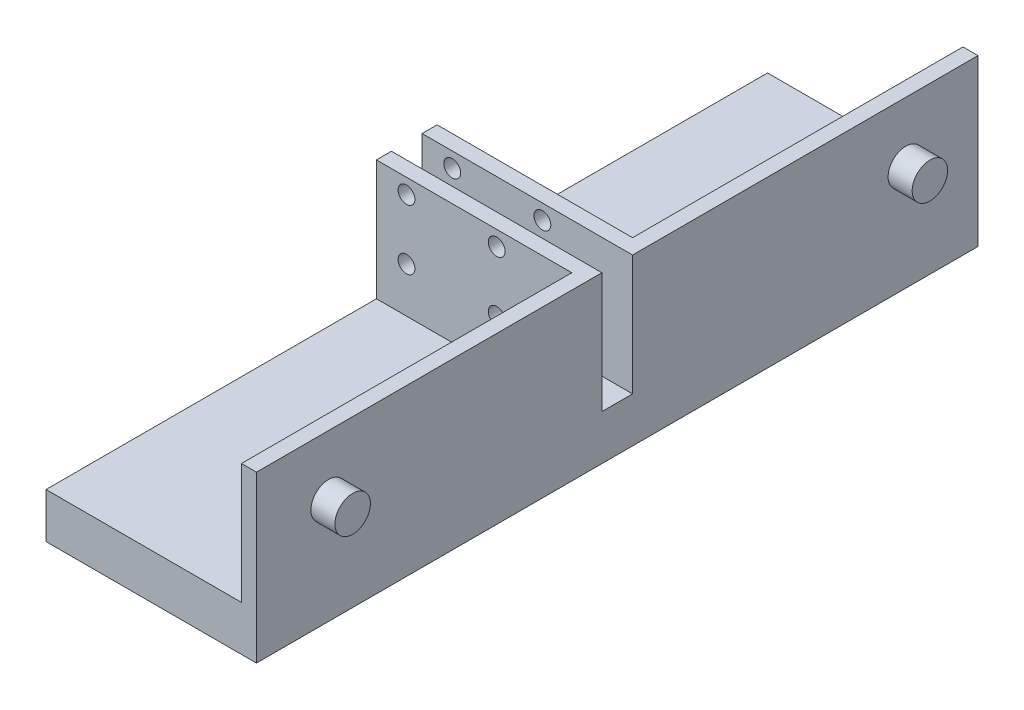
ISO-10303-21;
HEADER;
FILE_DESCRIPTION(('STEP AP214'),'2;1');
FILE_NAME('part.step','',(''),(''),'','','');
FILE_SCHEMA(('AUTOMOTIVE_DESIGN { 1 0 10303 214 1 1 1 1 }'));
ENDSEC;
DATA;
#1=APPLICATION_CONTEXT('core data for automotive mechanical design processes');
#2=APPLICATION_PROTOCOL_DEFINITION('international standard','automotive_design',2000,#1);
#3=PRODUCT_CONTEXT('',#1,'mechanical');
#4=PRODUCT('Part','Part','',(#3));
#5=PRODUCT_RELATED_PRODUCT_CATEGORY('part','',(#4));
#6=PRODUCT_DEFINITION_FORMATION('','',#4);
#7=PRODUCT_DEFINITION_CONTEXT('part definition',#1,'design');
#8=PRODUCT_DEFINITION('design','',#6,#7);
#9=PRODUCT_DEFINITION_SHAPE('','',#8);
#10=(LENGTH_UNIT() NAMED_UNIT(*) SI_UNIT(.MILLI.,.METRE.));
#11=(NAMED_UNIT(*) PLANE_ANGLE_UNIT() SI_UNIT($,.RADIAN.));
#12=(NAMED_UNIT(*) SI_UNIT($,.STERADIAN.) SOLID_ANGLE_UNIT());
#13=UNCERTAINTY_MEASURE_WITH_UNIT(LENGTH_MEASURE(1.E-05),#10,'distance_accuracy_value','');
#14=(GEOMETRIC_REPRESENTATION_CONTEXT(3) GLOBAL_UNCERTAINTY_ASSIGNED_CONTEXT((#13)) GLOBAL_UNIT_ASSIGNED_CONTEXT((#10,
#11,#12)) REPRESENTATION_CONTEXT('',''));
#15=CARTESIAN_POINT('',(0.,0.,0.));
#16=DIRECTION('',(0.,0.,1.));
#17=DIRECTION('',(1.,0.,0.));
#18=AXIS2_PLACEMENT_3D('',#15,#16,#17);
#19=CARTESIAN_POINT('',(0.,7.5,0.));
#20=DIRECTION('',(0.,1.,0.));
#21=DIRECTION('',(0.,0.,1.));
#22=AXIS2_PLACEMENT_3D('',#19,#20,#21);
#23=PLANE('',#22);
#24=DIRECTION('',(0.,0.,-1.));
#25=VECTOR('',#24,1.);
#26=CARTESIAN_POINT('',(35.,7.5,-60.));
#27=LINE('',#26,#25);
#28=CARTESIAN_POINT('',(35.,7.5,2.54999999999999));
#29=VERTEX_POINT('',#28);
#30=CARTESIAN_POINT('',(35.,7.5,-2.55));
#31=VERTEX_POINT('',#30);
#32=EDGE_CURVE('E215',#29,#31,#27,.T.);
#33=ORIENTED_EDGE('',*,*,#32,.T.);
#34=DIRECTION('',(-1.,0.,0.));
#35=VECTOR('',#34,1.);
#36=CARTESIAN_POINT('',(0.,7.5,-2.54999999999993));
#37=LINE('',#36,#35);
#38=CARTESIAN_POINT('',(0.,7.5,-2.55));
#39=VERTEX_POINT('',#38);
#40=EDGE_CURVE('E160',#31,#39,#37,.T.);
#41=ORIENTED_EDGE('',*,*,#40,.T.);
#42=DIRECTION('',(0.,0.,1.));
#43=VECTOR('',#42,1.);
#44=CARTESIAN_POINT('',(0.,7.5,-60.));
#45=LINE('',#44,#43);
#46=CARTESIAN_POINT('',(0.,7.5,2.54999999999999));
#47=VERTEX_POINT('',#46);
#48=EDGE_CURVE('E212',#39,#47,#45,.T.);
#49=ORIENTED_EDGE('',*,*,#48,.T.);
#50=DIRECTION('',(-1.,0.,0.));
#51=VECTOR('',#50,1.);
#52=CARTESIAN_POINT('',(0.,7.5,2.55));
#53=LINE('',#52,#51);
#54=EDGE_CURVE('E178',#29,#47,#53,.T.);
#55=ORIENTED_EDGE('',*,*,#54,.F.);
#56=EDGE_LOOP('',(#33,#41,#49,#55));
#57=FACE_BOUND('',#56,.T.);
#58=ADVANCED_FACE('F39',(#57),#23,.T.);
#59=DIRECTION('',(0.,0.,1.));
#60=VECTOR('',#59,1.);
#61=CARTESIAN_POINT('',(32.5,7.5,0.));
#62=LINE('',#61,#60);
#63=CARTESIAN_POINT('',(32.5,7.5,5.04999999999999));
#64=VERTEX_POINT('',#63);
#65=CARTESIAN_POINT('',(32.5,7.5,59.9999999999999));
#66=VERTEX_POINT('',#65);
#67=EDGE_CURVE('E54',#64,#66,#62,.T.);
#68=ORIENTED_EDGE('',*,*,#67,.F.);
#69=DIRECTION('',(-1.,0.,0.));
#70=VECTOR('',#69,1.);
#71=CARTESIAN_POINT('',(0.,7.5,5.05));
#72=LINE('',#71,#70);
#73=CARTESIAN_POINT('',(0.,7.5,5.04999999999999));
#74=VERTEX_POINT('',#73);
#75=EDGE_CURVE('E190',#64,#74,#72,.T.);
#76=ORIENTED_EDGE('',*,*,#75,.T.);
#77=CARTESIAN_POINT('',(0.,7.5,60.));
#78=VERTEX_POINT('',#77);
#79=EDGE_CURVE('E213',#74,#78,#45,.T.);
#80=ORIENTED_EDGE('',*,*,#79,.T.);
#81=DIRECTION('',(1.,0.,0.));
#82=VECTOR('',#81,1.);
#83=CARTESIAN_POINT('',(0.,7.5,60.));
#84=LINE('',#83,#82);
#85=EDGE_CURVE('E211',#78,#66,#84,.T.);
#86=ORIENTED_EDGE('',*,*,#85,.T.);
#87=EDGE_LOOP('',(#68,#76,#80,#86));
#88=FACE_BOUND('',#87,.T.);
#89=ADVANCED_FACE('F304',(#88),#23,.T.);
#90=CARTESIAN_POINT('',(0.,7.5,-60.));
#91=DIRECTION('',(1.,0.,0.));
#92=DIRECTION('',(0.,0.,-1.));
#93=AXIS2_PLACEMENT_3D('',#90,#91,#92);
#94=PLANE('',#93);
#95=DIRECTION('',(0.,0.,1.));
#96=VECTOR('',#95,1.);
#97=CARTESIAN_POINT('',(0.,0.,-60.));
#98=LINE('',#97,#96);
#99=CARTESIAN_POINT('',(0.,0.,-60.));
#100=VERTEX_POINT('',#99);
#101=CARTESIAN_POINT('',(0.,0.,60.));
#102=VERTEX_POINT('',#101);
#103=EDGE_CURVE('E165',#100,#102,#98,.T.);
#104=ORIENTED_EDGE('',*,*,#103,.T.);
#105=DIRECTION('',(0.,-1.,0.));
#106=VECTOR('',#105,1.);
#107=CARTESIAN_POINT('',(0.,7.5,60.));
#108=LINE('',#107,#106);
#109=EDGE_CURVE('E231',#78,#102,#108,.T.);
#110=ORIENTED_EDGE('',*,*,#109,.F.);
#111=ORIENTED_EDGE('',*,*,#79,.F.);
#112=DIRECTION('',(0.,-1.,0.));
#113=VECTOR('',#112,1.);
#114=CARTESIAN_POINT('',(0.,27.5,5.04999999999999));
#115=LINE('',#114,#113);
#116=CARTESIAN_POINT('',(0.,27.5,5.04999999999999));
#117=VERTEX_POINT('',#116);
#118=EDGE_CURVE('E189',#117,#74,#115,.T.);
#119=ORIENTED_EDGE('',*,*,#118,.F.);
#120=DIRECTION('',(0.,0.,1.));
#121=VECTOR('',#120,1.);
#122=CARTESIAN_POINT('',(0.,27.5,0.));
#123=LINE('',#122,#121);
#124=CARTESIAN_POINT('',(0.,27.5,2.54999999999999));
#125=VERTEX_POINT('',#124);
#126=EDGE_CURVE('E187',#125,#117,#123,.T.);
#127=ORIENTED_EDGE('',*,*,#126,.F.);
#128=DIRECTION('',(0.,-1.,0.));
#129=VECTOR('',#128,1.);
#130=CARTESIAN_POINT('',(0.,27.5,2.54999999999999));
#131=LINE('',#130,#129);
#132=EDGE_CURVE('E198',#125,#47,#131,.T.);
#133=ORIENTED_EDGE('',*,*,#132,.T.);
#134=ORIENTED_EDGE('',*,*,#48,.F.);
#135=DIRECTION('',(0.,-1.,0.));
#136=VECTOR('',#135,1.);
#137=CARTESIAN_POINT('',(0.,27.5,-2.54999999999999));
#138=LINE('',#137,#136);
#139=CARTESIAN_POINT('',(0.,27.5,-2.54999999999999));
#140=VERTEX_POINT('',#139);
#141=EDGE_CURVE('E290',#140,#39,#138,.T.);
#142=ORIENTED_EDGE('',*,*,#141,.F.);
#143=DIRECTION('',(0.,0.,1.));
#144=VECTOR('',#143,1.);
#145=CARTESIAN_POINT('',(0.,27.5,0.));
#146=LINE('',#145,#144);
#147=CARTESIAN_POINT('',(0.,27.5,-5.05));
#148=VERTEX_POINT('',#147);
#149=EDGE_CURVE('E299',#148,#140,#146,.T.);
#150=ORIENTED_EDGE('',*,*,#149,.F.);
#151=DIRECTION('',(0.,-1.,0.));
#152=VECTOR('',#151,1.);
#153=CARTESIAN_POINT('',(0.,27.5,-5.05));
#154=LINE('',#153,#152);
#155=CARTESIAN_POINT('',(0.,7.5,-5.05));
#156=VERTEX_POINT('',#155);
#157=EDGE_CURVE('E170',#148,#156,#154,.T.);
#158=ORIENTED_EDGE('',*,*,#157,.T.);
#159=CARTESIAN_POINT('',(0.,7.5,-60.));
#160=VERTEX_POINT('',#159);
#161=EDGE_CURVE('E209',#160,#156,#45,.T.);
#162=ORIENTED_EDGE('',*,*,#161,.F.);
#163=DIRECTION('',(0.,-1.,0.));
#164=VECTOR('',#163,1.);
#165=CARTESIAN_POINT('',(0.,7.5,-60.));
#166=LINE('',#165,#164);
#167=EDGE_CURVE('E217',#160,#100,#166,.T.);
#168=ORIENTED_EDGE('',*,*,#167,.T.);
#169=EDGE_LOOP('',(#104,#110,#111,#119,#127,#133,#134,#142,#150,#158,#162,#168));
#170=FACE_BOUND('',#169,.T.);
#171=ADVANCED_FACE('F41',(#170),#94,.F.);
#172=CARTESIAN_POINT('',(0.,7.5,60.));
#173=DIRECTION('',(0.,0.,-1.));
#174=DIRECTION('',(-1.,0.,0.));
#175=AXIS2_PLACEMENT_3D('',#172,#173,#174);
#176=PLANE('',#175);
#177=DIRECTION('',(1.,0.,0.));
#178=VECTOR('',#177,1.);
#179=CARTESIAN_POINT('',(0.,0.,60.));
#180=LINE('',#179,#178);
#181=CARTESIAN_POINT('',(35.,0.,59.9999999999999));
#182=VERTEX_POINT('',#181);
#183=EDGE_CURVE('E168',#102,#182,#180,.T.);
#184=ORIENTED_EDGE('',*,*,#183,.T.);
#185=DIRECTION('',(0.,-1.,0.));
#186=VECTOR('',#185,1.);
#187=CARTESIAN_POINT('',(35.,7.5,59.9999999999999));
#188=LINE('',#187,#186);
#189=CARTESIAN_POINT('',(35.,27.5,59.9999999999999));
#190=VERTEX_POINT('',#189);
#191=EDGE_CURVE('E228',#190,#182,#188,.T.);
#192=ORIENTED_EDGE('',*,*,#191,.F.);
#193=DIRECTION('',(1.,0.,0.));
#194=VECTOR('',#193,1.);
#195=CARTESIAN_POINT('',(0.,27.5,60.));
#196=LINE('',#195,#194);
#197=CARTESIAN_POINT('',(32.5,27.5,59.9999999999999));
#198=VERTEX_POINT('',#197);
#199=EDGE_CURVE('E180',#198,#190,#196,.T.);
#200=ORIENTED_EDGE('',*,*,#199,.F.);
#201=DIRECTION('',(0.,-1.,0.));
#202=VECTOR('',#201,1.);
#203=CARTESIAN_POINT('',(32.5,27.5,59.9999999999999));
#204=LINE('',#203,#202);
#205=EDGE_CURVE('E204',#198,#66,#204,.T.);
#206=ORIENTED_EDGE('',*,*,#205,.T.);
#207=ORIENTED_EDGE('',*,*,#85,.F.);
#208=ORIENTED_EDGE('',*,*,#109,.T.);
#209=EDGE_LOOP('',(#184,#192,#200,#206,#207,#208));
#210=FACE_BOUND('',#209,.T.);
#211=ADVANCED_FACE('F261',(#210),#176,.F.);
#212=CARTESIAN_POINT('',(35.,7.5,-60.));
#213=DIRECTION('',(-1.,0.,0.));
#214=DIRECTION('',(0.,0.,1.));
#215=AXIS2_PLACEMENT_3D('',#212,#213,#214);
#216=PLANE('',#215);
#217=CARTESIAN_POINT('',(35.,17.5,47.9999999999999));
#218=DIRECTION('',(-1.,0.,0.));
#219=DIRECTION('',(0.,0.,1.));
#220=AXIS2_PLACEMENT_3D('',#217,#218,#219);
#221=CIRCLE('',#220,2.95);
#222=CARTESIAN_POINT('',(35.,17.5,50.9499999999999));
#223=VERTEX_POINT('',#222);
#224=EDGE_CURVE('E11',#223,#223,#221,.F.);
#225=ORIENTED_EDGE('',*,*,#224,.F.);
#226=EDGE_LOOP('',(#225));
#227=FACE_BOUND('',#226,.T.);
#228=CARTESIAN_POINT('',(35.,17.5,-48.));
#229=DIRECTION('',(-1.,0.,0.));
#230=DIRECTION('',(0.,0.,1.));
#231=AXIS2_PLACEMENT_3D('',#228,#229,#230);
#232=CIRCLE('',#231,2.95);
#233=CARTESIAN_POINT('',(35.,17.5,-45.05));
#234=VERTEX_POINT('',#233);
#235=EDGE_CURVE('E47',#234,#234,#232,.F.);
#236=ORIENTED_EDGE('',*,*,#235,.F.);
#237=EDGE_LOOP('',(#236));
#238=FACE_BOUND('',#237,.T.);
#239=DIRECTION('',(0.,0.,-1.));
#240=VECTOR('',#239,1.);
#241=CARTESIAN_POINT('',(35.,0.,-60.));
#242=LINE('',#241,#240);
#243=CARTESIAN_POINT('',(35.,0.,-60.));
#244=VERTEX_POINT('',#243);
#245=EDGE_CURVE('E220',#182,#244,#242,.T.);
#246=ORIENTED_EDGE('',*,*,#245,.T.);
#247=DIRECTION('',(0.,-1.,0.));
#248=VECTOR('',#247,1.);
#249=CARTESIAN_POINT('',(35.,7.5,-60.));
#250=LINE('',#249,#248);
#251=CARTESIAN_POINT('',(35.,27.5,-60.));
#252=VERTEX_POINT('',#251);
#253=EDGE_CURVE('E226',#252,#244,#250,.T.);
#254=ORIENTED_EDGE('',*,*,#253,.F.);
#255=DIRECTION('',(0.,0.,-1.));
#256=VECTOR('',#255,1.);
#257=CARTESIAN_POINT('',(35.,27.5,0.));
#258=LINE('',#257,#256);
#259=CARTESIAN_POINT('',(35.,27.5,-2.55));
#260=VERTEX_POINT('',#259);
#261=EDGE_CURVE('E157',#260,#252,#258,.T.);
#262=ORIENTED_EDGE('',*,*,#261,.F.);
#263=DIRECTION('',(0.,-1.,0.));
#264=VECTOR('',#263,1.);
#265=CARTESIAN_POINT('',(35.,27.5,-2.55));
#266=LINE('',#265,#264);
#267=EDGE_CURVE('E287',#260,#31,#266,.T.);
#268=ORIENTED_EDGE('',*,*,#267,.T.);
#269=ORIENTED_EDGE('',*,*,#32,.F.);
#270=DIRECTION('',(0.,-1.,0.));
#271=VECTOR('',#270,1.);
#272=CARTESIAN_POINT('',(35.,27.5,2.54999999999999));
#273=LINE('',#272,#271);
#274=CARTESIAN_POINT('',(35.,27.5,2.54999999999999));
#275=VERTEX_POINT('',#274);
#276=EDGE_CURVE('E201',#275,#29,#273,.T.);
#277=ORIENTED_EDGE('',*,*,#276,.F.);
#278=DIRECTION('',(0.,0.,-1.));
#279=VECTOR('',#278,1.);
#280=CARTESIAN_POINT('',(35.,27.5,0.));
#281=LINE('',#280,#279);
#282=EDGE_CURVE('E183',#190,#275,#281,.T.);
#283=ORIENTED_EDGE('',*,*,#282,.F.);
#284=ORIENTED_EDGE('',*,*,#191,.T.);
#285=EDGE_LOOP('',(#246,#254,#262,#268,#269,#277,#283,#284));
#286=FACE_BOUND('',#285,.T.);
#287=ADVANCED_FACE('F258',(#227,#238,#286),#216,.F.);
#288=CARTESIAN_POINT('',(0.,7.5,-60.));
#289=DIRECTION('',(0.,0.,1.));
#290=DIRECTION('',(1.,0.,0.));
#291=AXIS2_PLACEMENT_3D('',#288,#289,#290);
#292=PLANE('',#291);
#293=DIRECTION('',(-1.,0.,0.));
#294=VECTOR('',#293,1.);
#295=CARTESIAN_POINT('',(0.,0.,-60.));
#296=LINE('',#295,#294);
#297=EDGE_CURVE('E222',#244,#100,#296,.T.);
#298=ORIENTED_EDGE('',*,*,#297,.T.);
#299=ORIENTED_EDGE('',*,*,#167,.F.);
#300=DIRECTION('',(-1.,0.,0.));
#301=VECTOR('',#300,1.);
#302=CARTESIAN_POINT('',(0.,7.5,-60.));
#303=LINE('',#302,#301);
#304=CARTESIAN_POINT('',(32.5,7.5,-60.));
#305=VERTEX_POINT('',#304);
#306=EDGE_CURVE('E164',#305,#160,#303,.T.);
#307=ORIENTED_EDGE('',*,*,#306,.F.);
#308=DIRECTION('',(0.,-1.,0.));
#309=VECTOR('',#308,1.);
#310=CARTESIAN_POINT('',(32.5,27.5,-60.));
#311=LINE('',#310,#309);
#312=CARTESIAN_POINT('',(32.5,27.5,-60.));
#313=VERTEX_POINT('',#312);
#314=EDGE_CURVE('E144',#313,#305,#311,.T.);
#315=ORIENTED_EDGE('',*,*,#314,.F.);
#316=DIRECTION('',(-1.,0.,0.));
#317=VECTOR('',#316,1.);
#318=CARTESIAN_POINT('',(0.,27.5,-60.));
#319=LINE('',#318,#317);
#320=EDGE_CURVE('E150',#252,#313,#319,.T.);
#321=ORIENTED_EDGE('',*,*,#320,.F.);
#322=ORIENTED_EDGE('',*,*,#253,.T.);
#323=EDGE_LOOP('',(#298,#299,#307,#315,#321,#322));
#324=FACE_BOUND('',#323,.T.);
#325=ADVANCED_FACE('F162',(#324),#292,.F.);
#326=DIRECTION('',(-1.,0.,0.));
#327=VECTOR('',#326,1.);
#328=CARTESIAN_POINT('',(0.,7.5,-5.05));
#329=LINE('',#328,#327);
#330=CARTESIAN_POINT('',(32.5,7.5,-5.05));
#331=VERTEX_POINT('',#330);
#332=EDGE_CURVE('E279',#331,#156,#329,.T.);
#333=ORIENTED_EDGE('',*,*,#332,.F.);
#334=DIRECTION('',(0.,0.,1.));
#335=VECTOR('',#334,1.);
#336=CARTESIAN_POINT('',(32.5,7.5,0.));
#337=LINE('',#336,#335);
#338=EDGE_CURVE('E62',#305,#331,#337,.T.);
#339=ORIENTED_EDGE('',*,*,#338,.F.);
#340=ORIENTED_EDGE('',*,*,#306,.T.);
#341=ORIENTED_EDGE('',*,*,#161,.T.);
#342=EDGE_LOOP('',(#333,#339,#340,#341));
#343=FACE_BOUND('',#342,.T.);
#344=ADVANCED_FACE('F278',(#343),#23,.T.);
#345=CARTESIAN_POINT('',(0.,0.,0.));
#346=DIRECTION('',(0.,1.,0.));
#347=DIRECTION('',(0.,0.,1.));
#348=AXIS2_PLACEMENT_3D('',#345,#346,#347);
#349=PLANE('',#348);
#350=ORIENTED_EDGE('',*,*,#103,.F.);
#351=ORIENTED_EDGE('',*,*,#297,.F.);
#352=ORIENTED_EDGE('',*,*,#245,.F.);
#353=ORIENTED_EDGE('',*,*,#183,.F.);
#354=EDGE_LOOP('',(#350,#351,#352,#353));
#355=FACE_BOUND('',#354,.T.);
#356=ADVANCED_FACE('F269',(#355),#349,.F.);
#357=CARTESIAN_POINT('',(0.,27.5,5.05));
#358=DIRECTION('',(0.,0.,1.));
#359=DIRECTION('',(1.,0.,0.));
#360=AXIS2_PLACEMENT_3D('',#357,#358,#359);
#361=PLANE('',#360);
#362=CARTESIAN_POINT('',(4.99999999999999,15.,5.05));
#363=DIRECTION('',(0.,0.,1.));
#364=DIRECTION('',(1.,0.,0.));
#365=AXIS2_PLACEMENT_3D('',#362,#363,#364);
#366=CIRCLE('',#365,1.4);
#367=CARTESIAN_POINT('',(6.4,15.,5.05));
#368=VERTEX_POINT('',#367);
#369=EDGE_CURVE('E345',#368,#368,#366,.T.);
#370=ORIENTED_EDGE('',*,*,#369,.F.);
#371=EDGE_LOOP('',(#370));
#372=FACE_BOUND('',#371,.T.);
#373=CARTESIAN_POINT('',(20.,25.,5.05));
#374=DIRECTION('',(0.,0.,1.));
#375=DIRECTION('',(1.,0.,0.));
#376=AXIS2_PLACEMENT_3D('',#373,#374,#375);
#377=CIRCLE('',#376,1.4);
#378=CARTESIAN_POINT('',(21.4,25.,5.05));
#379=VERTEX_POINT('',#378);
#380=EDGE_CURVE('E346',#379,#379,#377,.T.);
#381=ORIENTED_EDGE('',*,*,#380,.F.);
#382=EDGE_LOOP('',(#381));
#383=FACE_BOUND('',#382,.T.);
#384=CARTESIAN_POINT('',(20.,15.,5.05));
#385=DIRECTION('',(0.,0.,1.));
#386=DIRECTION('',(1.,0.,0.));
#387=AXIS2_PLACEMENT_3D('',#384,#385,#386);
#388=CIRCLE('',#387,1.4);
#389=CARTESIAN_POINT('',(21.4,15.,5.05));
#390=VERTEX_POINT('',#389);
#391=EDGE_CURVE('E349',#390,#390,#388,.T.);
#392=ORIENTED_EDGE('',*,*,#391,.F.);
#393=EDGE_LOOP('',(#392));
#394=FACE_BOUND('',#393,.T.);
#395=CARTESIAN_POINT('',(4.99999999999999,25.,5.05));
#396=DIRECTION('',(0.,0.,1.));
#397=DIRECTION('',(1.,0.,0.));
#398=AXIS2_PLACEMENT_3D('',#395,#396,#397);
#399=CIRCLE('',#398,1.4);
#400=CARTESIAN_POINT('',(6.39999999999999,25.,5.05));
#401=VERTEX_POINT('',#400);
#402=EDGE_CURVE('E238',#401,#401,#399,.T.);
#403=ORIENTED_EDGE('',*,*,#402,.F.);
#404=EDGE_LOOP('',(#403));
#405=FACE_BOUND('',#404,.T.);
#406=ORIENTED_EDGE('',*,*,#75,.F.);
#407=DIRECTION('',(0.,-1.,0.));
#408=VECTOR('',#407,1.);
#409=CARTESIAN_POINT('',(32.5,27.5,5.04999999999999));
#410=LINE('',#409,#408);
#411=CARTESIAN_POINT('',(32.5,27.5,5.04999999999999));
#412=VERTEX_POINT('',#411);
#413=EDGE_CURVE('E207',#412,#64,#410,.T.);
#414=ORIENTED_EDGE('',*,*,#413,.F.);
#415=DIRECTION('',(-1.,0.,0.));
#416=VECTOR('',#415,1.);
#417=CARTESIAN_POINT('',(0.,27.5,5.05));
#418=LINE('',#417,#416);
#419=EDGE_CURVE('E174',#412,#117,#418,.T.);
#420=ORIENTED_EDGE('',*,*,#419,.T.);
#421=ORIENTED_EDGE('',*,*,#118,.T.);
#422=EDGE_LOOP('',(#406,#414,#420,#421));
#423=FACE_BOUND('',#422,.T.);
#424=ADVANCED_FACE('F315',(#372,#383,#394,#405,#423),#361,.T.);
#425=CARTESIAN_POINT('',(32.5,27.5,0.));
#426=DIRECTION('',(1.,0.,0.));
#427=DIRECTION('',(0.,0.,-1.));
#428=AXIS2_PLACEMENT_3D('',#425,#426,#427);
#429=PLANE('',#428);
#430=ORIENTED_EDGE('',*,*,#67,.T.);
#431=ORIENTED_EDGE('',*,*,#205,.F.);
#432=DIRECTION('',(0.,0.,1.));
#433=VECTOR('',#432,1.);
#434=CARTESIAN_POINT('',(32.5,27.5,0.));
#435=LINE('',#434,#433);
#436=EDGE_CURVE('E177',#412,#198,#435,.T.);
#437=ORIENTED_EDGE('',*,*,#436,.F.);
#438=ORIENTED_EDGE('',*,*,#413,.T.);
#439=EDGE_LOOP('',(#430,#431,#437,#438));
#440=FACE_BOUND('',#439,.T.);
#441=ADVANCED_FACE('F312',(#440),#429,.F.);
#442=CARTESIAN_POINT('',(0.,27.5,2.55));
#443=DIRECTION('',(0.,0.,1.));
#444=DIRECTION('',(1.,0.,0.));
#445=AXIS2_PLACEMENT_3D('',#442,#443,#444);
#446=PLANE('',#445);
#447=CARTESIAN_POINT('',(4.99999999999999,15.,2.55));
#448=DIRECTION('',(0.,0.,1.));
#449=DIRECTION('',(1.,0.,0.));
#450=AXIS2_PLACEMENT_3D('',#447,#448,#449);
#451=CIRCLE('',#450,1.4);
#452=CARTESIAN_POINT('',(6.4,15.,2.55));
#453=VERTEX_POINT('',#452);
#454=EDGE_CURVE('E192',#453,#453,#451,.T.);
#455=ORIENTED_EDGE('',*,*,#454,.T.);
#456=EDGE_LOOP('',(#455));
#457=FACE_BOUND('',#456,.T.);
#458=CARTESIAN_POINT('',(20.,25.,2.54999999999999));
#459=DIRECTION('',(0.,0.,1.));
#460=DIRECTION('',(1.,0.,0.));
#461=AXIS2_PLACEMENT_3D('',#458,#459,#460);
#462=CIRCLE('',#461,1.4);
#463=CARTESIAN_POINT('',(21.4,25.,2.54999999999999));
#464=VERTEX_POINT('',#463);
#465=EDGE_CURVE('E252',#464,#464,#462,.T.);
#466=ORIENTED_EDGE('',*,*,#465,.T.);
#467=EDGE_LOOP('',(#466));
#468=FACE_BOUND('',#467,.T.);
#469=CARTESIAN_POINT('',(20.,15.,2.54999999999999));
#470=DIRECTION('',(0.,0.,1.));
#471=DIRECTION('',(1.,0.,0.));
#472=AXIS2_PLACEMENT_3D('',#469,#470,#471);
#473=CIRCLE('',#472,1.4);
#474=CARTESIAN_POINT('',(21.4,15.,2.54999999999999));
#475=VERTEX_POINT('',#474);
#476=EDGE_CURVE('E248',#475,#475,#473,.T.);
#477=ORIENTED_EDGE('',*,*,#476,.T.);
#478=EDGE_LOOP('',(#477));
#479=FACE_BOUND('',#478,.T.);
#480=CARTESIAN_POINT('',(4.99999999999999,25.,2.55));
#481=DIRECTION('',(0.,0.,1.));
#482=DIRECTION('',(1.,0.,0.));
#483=AXIS2_PLACEMENT_3D('',#480,#481,#482);
#484=CIRCLE('',#483,1.4);
#485=CARTESIAN_POINT('',(6.39999999999999,25.,2.55));
#486=VERTEX_POINT('',#485);
#487=EDGE_CURVE('E243',#486,#486,#484,.T.);
#488=ORIENTED_EDGE('',*,*,#487,.T.);
#489=EDGE_LOOP('',(#488));
#490=FACE_BOUND('',#489,.T.);
#491=ORIENTED_EDGE('',*,*,#54,.T.);
#492=ORIENTED_EDGE('',*,*,#132,.F.);
#493=DIRECTION('',(-1.,0.,0.));
#494=VECTOR('',#493,1.);
#495=CARTESIAN_POINT('',(0.,27.5,2.55));
#496=LINE('',#495,#494);
#497=EDGE_CURVE('E185',#275,#125,#496,.T.);
#498=ORIENTED_EDGE('',*,*,#497,.F.);
#499=ORIENTED_EDGE('',*,*,#276,.T.);
#500=EDGE_LOOP('',(#491,#492,#498,#499));
#501=FACE_BOUND('',#500,.T.);
#502=ADVANCED_FACE('F321',(#457,#468,#479,#490,#501),#446,.F.);
#503=CARTESIAN_POINT('',(0.,27.5,0.));
#504=DIRECTION('',(0.,1.,0.));
#505=DIRECTION('',(0.,0.,1.));
#506=AXIS2_PLACEMENT_3D('',#503,#504,#505);
#507=PLANE('',#506);
#508=ORIENTED_EDGE('',*,*,#419,.F.);
#509=ORIENTED_EDGE('',*,*,#436,.T.);
#510=ORIENTED_EDGE('',*,*,#199,.T.);
#511=ORIENTED_EDGE('',*,*,#282,.T.);
#512=ORIENTED_EDGE('',*,*,#497,.T.);
#513=ORIENTED_EDGE('',*,*,#126,.T.);
#514=EDGE_LOOP('',(#508,#509,#510,#511,#512,#513));
#515=FACE_BOUND('',#514,.T.);
#516=ADVANCED_FACE('F317',(#515),#507,.T.);
#517=CARTESIAN_POINT('',(32.5,27.5,0.));
#518=DIRECTION('',(1.,0.,0.));
#519=DIRECTION('',(0.,0.,-1.));
#520=AXIS2_PLACEMENT_3D('',#517,#518,#519);
#521=PLANE('',#520);
#522=ORIENTED_EDGE('',*,*,#338,.T.);
#523=DIRECTION('',(0.,-1.,0.));
#524=VECTOR('',#523,1.);
#525=CARTESIAN_POINT('',(32.5,27.5,-5.05));
#526=LINE('',#525,#524);
#527=CARTESIAN_POINT('',(32.5,27.5,-5.05));
#528=VERTEX_POINT('',#527);
#529=EDGE_CURVE('E146',#528,#331,#526,.T.);
#530=ORIENTED_EDGE('',*,*,#529,.F.);
#531=DIRECTION('',(0.,0.,1.));
#532=VECTOR('',#531,1.);
#533=CARTESIAN_POINT('',(32.5,27.5,0.));
#534=LINE('',#533,#532);
#535=EDGE_CURVE('E140',#313,#528,#534,.T.);
#536=ORIENTED_EDGE('',*,*,#535,.F.);
#537=ORIENTED_EDGE('',*,*,#314,.T.);
#538=EDGE_LOOP('',(#522,#530,#536,#537));
#539=FACE_BOUND('',#538,.T.);
#540=ADVANCED_FACE('F142',(#539),#521,.F.);
#541=CARTESIAN_POINT('',(0.,27.5,-5.05));
#542=DIRECTION('',(0.,0.,1.));
#543=DIRECTION('',(1.,0.,0.));
#544=AXIS2_PLACEMENT_3D('',#541,#542,#543);
#545=PLANE('',#544);
#546=CARTESIAN_POINT('',(4.99999999999999,15.,-5.05));
#547=DIRECTION('',(0.,0.,1.));
#548=DIRECTION('',(1.,0.,0.));
#549=AXIS2_PLACEMENT_3D('',#546,#547,#548);
#550=CIRCLE('',#549,1.4);
#551=CARTESIAN_POINT('',(6.4,15.,-5.05));
#552=VERTEX_POINT('',#551);
#553=EDGE_CURVE('E251',#552,#552,#550,.T.);
#554=ORIENTED_EDGE('',*,*,#553,.T.);
#555=EDGE_LOOP('',(#554));
#556=FACE_BOUND('',#555,.T.);
#557=CARTESIAN_POINT('',(20.,25.,-5.05));
#558=DIRECTION('',(0.,0.,1.));
#559=DIRECTION('',(1.,0.,0.));
#560=AXIS2_PLACEMENT_3D('',#557,#558,#559);
#561=CIRCLE('',#560,1.4);
#562=CARTESIAN_POINT('',(21.4,25.,-5.05));
#563=VERTEX_POINT('',#562);
#564=EDGE_CURVE('E247',#563,#563,#561,.T.);
#565=ORIENTED_EDGE('',*,*,#564,.T.);
#566=EDGE_LOOP('',(#565));
#567=FACE_BOUND('',#566,.T.);
#568=CARTESIAN_POINT('',(20.,15.,-5.05));
#569=DIRECTION('',(0.,0.,1.));
#570=DIRECTION('',(1.,0.,0.));
#571=AXIS2_PLACEMENT_3D('',#568,#569,#570);
#572=CIRCLE('',#571,1.4);
#573=CARTESIAN_POINT('',(21.4,15.,-5.05));
#574=VERTEX_POINT('',#573);
#575=EDGE_CURVE('E242',#574,#574,#572,.T.);
#576=ORIENTED_EDGE('',*,*,#575,.T.);
#577=EDGE_LOOP('',(#576));
#578=FACE_BOUND('',#577,.T.);
#579=CARTESIAN_POINT('',(4.99999999999999,25.,-5.05));
#580=DIRECTION('',(0.,0.,1.));
#581=DIRECTION('',(1.,0.,0.));
#582=AXIS2_PLACEMENT_3D('',#579,#580,#581);
#583=CIRCLE('',#582,1.4);
#584=CARTESIAN_POINT('',(6.39999999999999,25.,-5.05));
#585=VERTEX_POINT('',#584);
#586=EDGE_CURVE('E237',#585,#585,#583,.T.);
#587=ORIENTED_EDGE('',*,*,#586,.T.);
#588=EDGE_LOOP('',(#587));
#589=FACE_BOUND('',#588,.T.);
#590=ORIENTED_EDGE('',*,*,#332,.T.);
#591=ORIENTED_EDGE('',*,*,#157,.F.);
#592=DIRECTION('',(-1.,0.,0.));
#593=VECTOR('',#592,1.);
#594=CARTESIAN_POINT('',(0.,27.5,-5.05));
#595=LINE('',#594,#593);
#596=EDGE_CURVE('E149',#528,#148,#595,.T.);
#597=ORIENTED_EDGE('',*,*,#596,.F.);
#598=ORIENTED_EDGE('',*,*,#529,.T.);
#599=EDGE_LOOP('',(#590,#591,#597,#598));
#600=FACE_BOUND('',#599,.T.);
#601=ADVANCED_FACE('F281',(#556,#567,#578,#589,#600),#545,.F.);
#602=CARTESIAN_POINT('',(0.,27.5,-2.54999999999993));
#603=DIRECTION('',(0.,0.,1.));
#604=DIRECTION('',(1.,0.,0.));
#605=AXIS2_PLACEMENT_3D('',#602,#603,#604);
#606=PLANE('',#605);
#607=CARTESIAN_POINT('',(4.99999999999999,15.,-2.54999999999994));
#608=DIRECTION('',(0.,0.,1.));
#609=DIRECTION('',(1.,0.,0.));
#610=AXIS2_PLACEMENT_3D('',#607,#608,#609);
#611=CIRCLE('',#610,1.4);
#612=CARTESIAN_POINT('',(6.4,15.,-2.54999999999994));
#613=VERTEX_POINT('',#612);
#614=EDGE_CURVE('E249',#613,#613,#611,.T.);
#615=ORIENTED_EDGE('',*,*,#614,.F.);
#616=EDGE_LOOP('',(#615));
#617=FACE_BOUND('',#616,.T.);
#618=CARTESIAN_POINT('',(20.,25.,-2.54999999999997));
#619=DIRECTION('',(0.,0.,1.));
#620=DIRECTION('',(1.,0.,0.));
#621=AXIS2_PLACEMENT_3D('',#618,#619,#620);
#622=CIRCLE('',#621,1.4);
#623=CARTESIAN_POINT('',(21.4,25.,-2.54999999999997));
#624=VERTEX_POINT('',#623);
#625=EDGE_CURVE('E244',#624,#624,#622,.T.);
#626=ORIENTED_EDGE('',*,*,#625,.F.);
#627=EDGE_LOOP('',(#626));
#628=FACE_BOUND('',#627,.T.);
#629=CARTESIAN_POINT('',(20.,15.,-2.54999999999997));
#630=DIRECTION('',(0.,0.,1.));
#631=DIRECTION('',(1.,0.,0.));
#632=AXIS2_PLACEMENT_3D('',#629,#630,#631);
#633=CIRCLE('',#632,1.4);
#634=CARTESIAN_POINT('',(21.4,15.,-2.54999999999997));
#635=VERTEX_POINT('',#634);
#636=EDGE_CURVE('E239',#635,#635,#633,.T.);
#637=ORIENTED_EDGE('',*,*,#636,.F.);
#638=EDGE_LOOP('',(#637));
#639=FACE_BOUND('',#638,.T.);
#640=CARTESIAN_POINT('',(4.99999999999999,25.,-2.54999999999994));
#641=DIRECTION('',(0.,0.,1.));
#642=DIRECTION('',(1.,0.,0.));
#643=AXIS2_PLACEMENT_3D('',#640,#641,#642);
#644=CIRCLE('',#643,1.4);
#645=CARTESIAN_POINT('',(6.39999999999999,25.,-2.54999999999994));
#646=VERTEX_POINT('',#645);
#647=EDGE_CURVE('E234',#646,#646,#644,.T.);
#648=ORIENTED_EDGE('',*,*,#647,.F.);
#649=EDGE_LOOP('',(#648));
#650=FACE_BOUND('',#649,.T.);
#651=ORIENTED_EDGE('',*,*,#40,.F.);
#652=ORIENTED_EDGE('',*,*,#267,.F.);
#653=DIRECTION('',(-1.,0.,0.));
#654=VECTOR('',#653,1.);
#655=CARTESIAN_POINT('',(0.,27.5,-2.54999999999993));
#656=LINE('',#655,#654);
#657=EDGE_CURVE('E297',#260,#140,#656,.T.);
#658=ORIENTED_EDGE('',*,*,#657,.T.);
#659=ORIENTED_EDGE('',*,*,#141,.T.);
#660=EDGE_LOOP('',(#651,#652,#658,#659));
#661=FACE_BOUND('',#660,.T.);
#662=ADVANCED_FACE('F296',(#617,#628,#639,#650,#661),#606,.T.);
#663=CARTESIAN_POINT('',(0.,27.5,0.));
#664=DIRECTION('',(0.,1.,0.));
#665=DIRECTION('',(0.,0.,1.));
#666=AXIS2_PLACEMENT_3D('',#663,#664,#665);
#667=PLANE('',#666);
#668=ORIENTED_EDGE('',*,*,#320,.T.);
#669=ORIENTED_EDGE('',*,*,#535,.T.);
#670=ORIENTED_EDGE('',*,*,#596,.T.);
#671=ORIENTED_EDGE('',*,*,#149,.T.);
#672=ORIENTED_EDGE('',*,*,#657,.F.);
#673=ORIENTED_EDGE('',*,*,#261,.T.);
#674=EDGE_LOOP('',(#668,#669,#670,#671,#672,#673));
#675=FACE_BOUND('',#674,.T.);
#676=ADVANCED_FACE('F154',(#675),#667,.T.);
#677=CARTESIAN_POINT('',(4.99999999999999,25.,-6.95));
#678=DIRECTION('',(0.,0.,1.));
#679=DIRECTION('',(1.,0.,0.));
#680=AXIS2_PLACEMENT_3D('',#677,#678,#679);
#681=CYLINDRICAL_SURFACE('',#680,1.4);
#682=ORIENTED_EDGE('',*,*,#647,.T.);
#683=EDGE_LOOP('',(#682));
#684=FACE_BOUND('',#683,.T.);
#685=ORIENTED_EDGE('',*,*,#586,.F.);
#686=EDGE_LOOP('',(#685));
#687=FACE_BOUND('',#686,.T.);
#688=ADVANCED_FACE('F479',(#684,#687),#681,.F.);
#689=CARTESIAN_POINT('',(20.,15.,-6.95));
#690=DIRECTION('',(0.,0.,1.));
#691=DIRECTION('',(1.,0.,0.));
#692=AXIS2_PLACEMENT_3D('',#689,#690,#691);
#693=CYLINDRICAL_SURFACE('',#692,1.4);
#694=ORIENTED_EDGE('',*,*,#636,.T.);
#695=EDGE_LOOP('',(#694));
#696=FACE_BOUND('',#695,.T.);
#697=ORIENTED_EDGE('',*,*,#575,.F.);
#698=EDGE_LOOP('',(#697));
#699=FACE_BOUND('',#698,.T.);
#700=ADVANCED_FACE('F488',(#696,#699),#693,.F.);
#701=CARTESIAN_POINT('',(20.,25.,-6.95));
#702=DIRECTION('',(0.,0.,1.));
#703=DIRECTION('',(1.,0.,0.));
#704=AXIS2_PLACEMENT_3D('',#701,#702,#703);
#705=CYLINDRICAL_SURFACE('',#704,1.4);
#706=ORIENTED_EDGE('',*,*,#625,.T.);
#707=EDGE_LOOP('',(#706));
#708=FACE_BOUND('',#707,.T.);
#709=ORIENTED_EDGE('',*,*,#564,.F.);
#710=EDGE_LOOP('',(#709));
#711=FACE_BOUND('',#710,.T.);
#712=ADVANCED_FACE('F498',(#708,#711),#705,.F.);
#713=CARTESIAN_POINT('',(4.99999999999999,15.,-6.95));
#714=DIRECTION('',(0.,0.,1.));
#715=DIRECTION('',(1.,0.,0.));
#716=AXIS2_PLACEMENT_3D('',#713,#714,#715);
#717=CYLINDRICAL_SURFACE('',#716,1.4);
#718=ORIENTED_EDGE('',*,*,#614,.T.);
#719=EDGE_LOOP('',(#718));
#720=FACE_BOUND('',#719,.T.);
#721=ORIENTED_EDGE('',*,*,#553,.F.);
#722=EDGE_LOOP('',(#721));
#723=FACE_BOUND('',#722,.T.);
#724=ADVANCED_FACE('F508',(#720,#723),#717,.F.);
#725=ORIENTED_EDGE('',*,*,#402,.T.);
#726=EDGE_LOOP('',(#725));
#727=FACE_BOUND('',#726,.T.);
#728=ORIENTED_EDGE('',*,*,#487,.F.);
#729=EDGE_LOOP('',(#728));
#730=FACE_BOUND('',#729,.T.);
#731=ADVANCED_FACE('F491',(#727,#730),#681,.F.);
#732=ORIENTED_EDGE('',*,*,#391,.T.);
#733=EDGE_LOOP('',(#732));
#734=FACE_BOUND('',#733,.T.);
#735=ORIENTED_EDGE('',*,*,#476,.F.);
#736=EDGE_LOOP('',(#735));
#737=FACE_BOUND('',#736,.T.);
#738=ADVANCED_FACE('F501',(#734,#737),#693,.F.);
#739=ORIENTED_EDGE('',*,*,#380,.T.);
#740=EDGE_LOOP('',(#739));
#741=FACE_BOUND('',#740,.T.);
#742=ORIENTED_EDGE('',*,*,#465,.F.);
#743=EDGE_LOOP('',(#742));
#744=FACE_BOUND('',#743,.T.);
#745=ADVANCED_FACE('F511',(#741,#744),#705,.F.);
#746=ORIENTED_EDGE('',*,*,#369,.T.);
#747=EDGE_LOOP('',(#746));
#748=FACE_BOUND('',#747,.T.);
#749=ORIENTED_EDGE('',*,*,#454,.F.);
#750=EDGE_LOOP('',(#749));
#751=FACE_BOUND('',#750,.T.);
#752=ADVANCED_FACE('F520',(#748,#751),#717,.F.);
#753=CARTESIAN_POINT('',(39.,17.5,-48.));
#754=DIRECTION('',(-1.,0.,0.));
#755=DIRECTION('',(0.,0.,1.));
#756=AXIS2_PLACEMENT_3D('',#753,#754,#755);
#757=CYLINDRICAL_SURFACE('',#756,2.95);
#758=CARTESIAN_POINT('',(39.,17.5,-48.));
#759=DIRECTION('',(1.,0.,0.));
#760=DIRECTION('',(0.,0.,1.));
#761=AXIS2_PLACEMENT_3D('',#758,#759,#760);
#762=CIRCLE('',#761,2.95);
#763=CARTESIAN_POINT('',(39.,17.5,-45.05));
#764=VERTEX_POINT('',#763);
#765=EDGE_CURVE('E355',#764,#764,#762,.T.);
#766=ORIENTED_EDGE('',*,*,#765,.F.);
#767=EDGE_LOOP('',(#766));
#768=FACE_BOUND('',#767,.T.);
#769=ORIENTED_EDGE('',*,*,#235,.T.);
#770=EDGE_LOOP('',(#769));
#771=FACE_BOUND('',#770,.T.);
#772=ADVANCED_FACE('F256',(#768,#771),#757,.T.);
#773=CARTESIAN_POINT('',(39.,17.5,-48.));
#774=DIRECTION('',(-1.,0.,0.));
#775=DIRECTION('',(0.,0.,1.));
#776=AXIS2_PLACEMENT_3D('',#773,#774,#775);
#777=PLANE('',#776);
#778=ORIENTED_EDGE('',*,*,#765,.T.);
#779=EDGE_LOOP('',(#778));
#780=FACE_BOUND('',#779,.T.);
#781=ADVANCED_FACE('F366',(#780),#777,.F.);
#782=CARTESIAN_POINT('',(39.,17.5,47.9999999999999));
#783=DIRECTION('',(-1.,0.,0.));
#784=DIRECTION('',(0.,0.,1.));
#785=AXIS2_PLACEMENT_3D('',#782,#783,#784);
#786=CYLINDRICAL_SURFACE('',#785,2.95);
#787=CARTESIAN_POINT('',(39.,17.5,47.9999999999999));
#788=DIRECTION('',(1.,0.,0.));
#789=DIRECTION('',(0.,0.,-1.));
#790=AXIS2_PLACEMENT_3D('',#787,#788,#789);
#791=CIRCLE('',#790,2.95);
#792=CARTESIAN_POINT('',(39.,17.5,45.0499999999999));
#793=VERTEX_POINT('',#792);
#794=EDGE_CURVE('E354',#793,#793,#791,.T.);
#795=ORIENTED_EDGE('',*,*,#794,.F.);
#796=EDGE_LOOP('',(#795));
#797=FACE_BOUND('',#796,.T.);
#798=ORIENTED_EDGE('',*,*,#224,.T.);
#799=EDGE_LOOP('',(#798));
#800=FACE_BOUND('',#799,.T.);
#801=ADVANCED_FACE('F363',(#797,#800),#786,.T.);
#802=CARTESIAN_POINT('',(39.,17.5,47.9999999999999));
#803=DIRECTION('',(1.,0.,0.));
#804=DIRECTION('',(0.,0.,-1.));
#805=AXIS2_PLACEMENT_3D('',#802,#803,#804);
#806=PLANE('',#805);
#807=ORIENTED_EDGE('',*,*,#794,.T.);
#808=EDGE_LOOP('',(#807));
#809=FACE_BOUND('',#808,.T.);
#810=ADVANCED_FACE('F361',(#809),#806,.T.);
#811=CLOSED_SHELL('',(#58,#89,#171,#211,#287,#325,#344,#356,#424,#441,#502,#516,#540,#601,#662,
#676,#688,#700,#712,#724,#731,#738,#745,#752,#772,#781,#801,#810));
#812=MANIFOLD_SOLID_BREP('B2',#811);
#813=ADVANCED_BREP_SHAPE_REPRESENTATION('',(#18,#812),#14);
#814=SHAPE_DEFINITION_REPRESENTATION(#9,#813);
ENDSEC;
END-ISO-10303-21;
